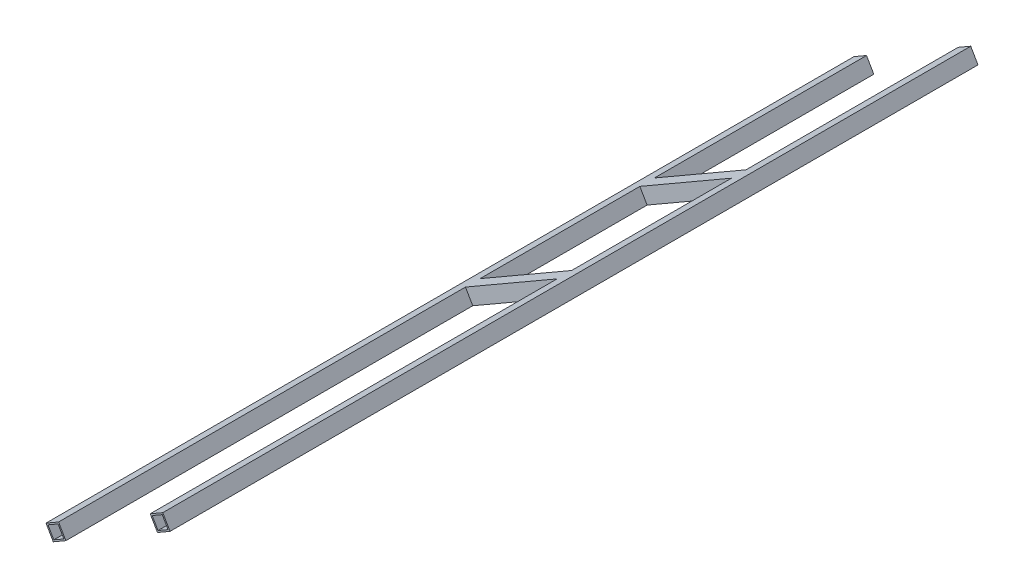
ISO-10303-21;
HEADER;
FILE_DESCRIPTION(('STEP AP214'),'2;1');
FILE_NAME('part.step','',(''),(''),'','','');
FILE_SCHEMA(('AUTOMOTIVE_DESIGN { 1 0 10303 214 1 1 1 1 }'));
ENDSEC;
DATA;
#1=APPLICATION_CONTEXT('core data for automotive mechanical design processes');
#2=APPLICATION_PROTOCOL_DEFINITION('international standard','automotive_design',2000,#1);
#3=PRODUCT_CONTEXT('',#1,'mechanical');
#4=PRODUCT('Part','Part','',(#3));
#5=PRODUCT_RELATED_PRODUCT_CATEGORY('part','',(#4));
#6=PRODUCT_DEFINITION_FORMATION('','',#4);
#7=PRODUCT_DEFINITION_CONTEXT('part definition',#1,'design');
#8=PRODUCT_DEFINITION('design','',#6,#7);
#9=PRODUCT_DEFINITION_SHAPE('','',#8);
#10=(LENGTH_UNIT() NAMED_UNIT(*) SI_UNIT(.MILLI.,.METRE.));
#11=(NAMED_UNIT(*) PLANE_ANGLE_UNIT() SI_UNIT($,.RADIAN.));
#12=(NAMED_UNIT(*) SI_UNIT($,.STERADIAN.) SOLID_ANGLE_UNIT());
#13=UNCERTAINTY_MEASURE_WITH_UNIT(LENGTH_MEASURE(1.E-05),#10,'distance_accuracy_value','');
#14=(GEOMETRIC_REPRESENTATION_CONTEXT(3) GLOBAL_UNCERTAINTY_ASSIGNED_CONTEXT((#13)) GLOBAL_UNIT_ASSIGNED_CONTEXT((#10,
#11,#12)) REPRESENTATION_CONTEXT('',''));
#15=CARTESIAN_POINT('',(0.,0.,0.));
#16=DIRECTION('',(0.,0.,1.));
#17=DIRECTION('',(1.,0.,0.));
#18=AXIS2_PLACEMENT_3D('',#15,#16,#17);
#19=CARTESIAN_POINT('',(230.918283708788,-157.653092530675,500000.000000032));
#20=DIRECTION('',(0.500000000000017,-0.866025403784429,0.));
#21=DIRECTION('',(0.866025403784429,0.500000000000017,0.));
#22=AXIS2_PLACEMENT_3D('',#19,#20,#21);
#23=PLANE('',#22);
#24=DIRECTION('',(0.,0.,1.));
#25=VECTOR('',#24,1.);
#26=CARTESIAN_POINT('',(250.828594313901,-146.157869343091,500000.000000032));
#27=LINE('',#26,#25);
#28=CARTESIAN_POINT('',(250.828594313956,-146.157869343075,1797.04999999997));
#29=VERTEX_POINT('',#28);
#30=CARTESIAN_POINT('',(250.828594313987,-146.157869343077,31.7499999998632));
#31=VERTEX_POINT('',#30);
#32=EDGE_CURVE('E475',#29,#31,#27,.F.);
#33=ORIENTED_EDGE('',*,*,#32,.T.);
#34=DIRECTION('',(-0.866025403784329,-0.50000000000019,0.));
#35=VECTOR('',#34,1.);
#36=CARTESIAN_POINT('',(250.828594313995,-146.157869343037,31.75));
#37=LINE('',#36,#35);
#38=CARTESIAN_POINT('',(228.831549057873,-158.857869343074,31.7499999999485));
#39=VERTEX_POINT('',#38);
#40=EDGE_CURVE('E428',#31,#39,#37,.T.);
#41=ORIENTED_EDGE('',*,*,#40,.T.);
#42=DIRECTION('',(0.,0.,1.));
#43=VECTOR('',#42,1.);
#44=CARTESIAN_POINT('',(228.831549057791,-158.857869343089,500000.000000032));
#45=LINE('',#44,#43);
#46=CARTESIAN_POINT('',(228.831549057873,-158.857869343071,1797.04999999992));
#47=VERTEX_POINT('',#46);
#48=EDGE_CURVE('E20',#39,#47,#45,.T.);
#49=ORIENTED_EDGE('',*,*,#48,.T.);
#50=DIRECTION('',(-0.866025403784409,-0.500000000000051,0.));
#51=VECTOR('',#50,1.);
#52=CARTESIAN_POINT('',(250.828594313995,-146.157869343028,1797.05));
#53=LINE('',#52,#51);
#54=EDGE_CURVE('E444',#29,#47,#53,.T.);
#55=ORIENTED_EDGE('',*,*,#54,.F.);
#56=EDGE_LOOP('',(#33,#41,#49,#55));
#57=FACE_BOUND('',#56,.T.);
#58=ADVANCED_FACE('F17',(#57),#23,.F.);
#59=CARTESIAN_POINT('',(217.920821551719,-139.959934955034,500000.000000032));
#60=DIRECTION('',(-0.866025403784429,-0.500000000000017,0.));
#61=DIRECTION('',(0.500000000000017,-0.866025403784429,0.));
#62=AXIS2_PLACEMENT_3D('',#59,#60,#61);
#63=PLANE('',#62);
#64=ORIENTED_EDGE('',*,*,#48,.F.);
#65=DIRECTION('',(-0.50000000000019,0.866025403784329,0.));
#66=VECTOR('',#65,1.);
#67=CARTESIAN_POINT('',(228.831549057881,-158.857869343037,31.75));
#68=LINE('',#67,#66);
#69=CARTESIAN_POINT('',(216.131549057838,-136.860824086947,31.7499999999485));
#70=VERTEX_POINT('',#69);
#71=EDGE_CURVE('E425',#39,#70,#68,.T.);
#72=ORIENTED_EDGE('',*,*,#71,.T.);
#73=DIRECTION('',(0.,0.,1.));
#74=VECTOR('',#73,1.);
#75=CARTESIAN_POINT('',(216.131549057902,-136.860824086958,500000.000000032));
#76=LINE('',#75,#74);
#77=CARTESIAN_POINT('',(216.131549057867,-136.860824086945,1797.04999999992));
#78=VERTEX_POINT('',#77);
#79=EDGE_CURVE('E477',#70,#78,#76,.T.);
#80=ORIENTED_EDGE('',*,*,#79,.T.);
#81=DIRECTION('',(-0.500000000000179,0.866025403784335,0.));
#82=VECTOR('',#81,1.);
#83=CARTESIAN_POINT('',(228.831549057881,-158.857869343024,1797.05));
#84=LINE('',#83,#82);
#85=EDGE_CURVE('E441',#47,#78,#84,.T.);
#86=ORIENTED_EDGE('',*,*,#85,.F.);
#87=EDGE_LOOP('',(#64,#72,#80,#86));
#88=FACE_BOUND('',#87,.T.);
#89=ADVANCED_FACE('F484',(#88),#63,.F.);
#90=CARTESIAN_POINT('',(220.47353476927,-134.353977467682,500000.000000032));
#91=DIRECTION('',(-0.500000000000017,0.866025403784429,0.));
#92=DIRECTION('',(-0.866025403784429,-0.500000000000017,0.));
#93=AXIS2_PLACEMENT_3D('',#90,#91,#92);
#94=PLANE('',#93);
#95=ORIENTED_EDGE('',*,*,#79,.F.);
#96=DIRECTION('',(0.866025403784328,0.500000000000191,0.));
#97=VECTOR('',#96,1.);
#98=CARTESIAN_POINT('',(216.131549057881,-136.860824086923,31.75));
#99=LINE('',#98,#97);
#100=CARTESIAN_POINT('',(238.128594313989,-124.160824086953,31.7499999999485));
#101=VERTEX_POINT('',#100);
#102=EDGE_CURVE('E422',#70,#101,#99,.T.);
#103=ORIENTED_EDGE('',*,*,#102,.T.);
#104=DIRECTION('',(0.,0.,1.));
#105=VECTOR('',#104,1.);
#106=CARTESIAN_POINT('',(238.128594313905,-124.160824086975,500000.000000032));
#107=LINE('',#106,#105);
#108=CARTESIAN_POINT('',(238.128594313989,-124.16082408695,1797.04999999992));
#109=VERTEX_POINT('',#108);
#110=EDGE_CURVE('E472',#101,#109,#107,.T.);
#111=ORIENTED_EDGE('',*,*,#110,.T.);
#112=DIRECTION('',(0.866025403784409,0.500000000000051,0.));
#113=VECTOR('',#112,1.);
#114=CARTESIAN_POINT('',(216.131549057881,-136.860824086909,1797.05));
#115=LINE('',#114,#113);
#116=EDGE_CURVE('E449',#78,#109,#115,.T.);
#117=ORIENTED_EDGE('',*,*,#116,.F.);
#118=EDGE_LOOP('',(#95,#103,#111,#117));
#119=FACE_BOUND('',#118,.T.);
#120=ADVANCED_FACE('F490',(#119),#94,.F.);
#121=CARTESIAN_POINT('',(239.986804896093,-127.379339226486,500000.000000032));
#122=DIRECTION('',(0.866025403784429,0.500000000000017,0.));
#123=DIRECTION('',(-0.500000000000017,0.866025403784429,0.));
#124=AXIS2_PLACEMENT_3D('',#121,#122,#123);
#125=PLANE('',#124);
#126=ORIENTED_EDGE('',*,*,#110,.F.);
#127=DIRECTION('',(0.50000000000019,-0.866025403784329,0.));
#128=VECTOR('',#127,1.);
#129=CARTESIAN_POINT('',(238.128594313995,-124.160824086923,31.75));
#130=LINE('',#129,#128);
#131=EDGE_CURVE('E419',#101,#31,#130,.T.);
#132=ORIENTED_EDGE('',*,*,#131,.T.);
#133=ORIENTED_EDGE('',*,*,#32,.F.);
#134=DIRECTION('',(0.500000000000179,-0.866025403784335,0.));
#135=VECTOR('',#134,1.);
#136=CARTESIAN_POINT('',(238.128594313995,-124.160824086914,1797.05));
#137=LINE('',#136,#135);
#138=EDGE_CURVE('E446',#109,#29,#137,.T.);
#139=ORIENTED_EDGE('',*,*,#138,.F.);
#140=EDGE_LOOP('',(#126,#132,#133,#139));
#141=FACE_BOUND('',#140,.T.);
#142=ADVANCED_FACE('F495',(#141),#125,.F.);
#143=CARTESIAN_POINT('',(12.2484484069404,-258.70493495511,500000.000000032));
#144=DIRECTION('',(-0.866025403784429,-0.500000000000017,0.));
#145=DIRECTION('',(0.500000000000017,-0.866025403784429,0.));
#146=AXIS2_PLACEMENT_3D('',#143,#144,#145);
#147=PLANE('',#146);
#148=DIRECTION('',(0.,0.,1.));
#149=VECTOR('',#148,1.);
#150=CARTESIAN_POINT('',(10.4591759131484,-255.605824086928,500000.000000032));
#151=LINE('',#150,#149);
#152=CARTESIAN_POINT('',(10.4591759130737,-255.605824086886,31.7499999999485));
#153=VERTEX_POINT('',#152);
#154=CARTESIAN_POINT('',(10.4591759130232,-255.605824086874,1797.04999999984));
#155=VERTEX_POINT('',#154);
#156=EDGE_CURVE('E466',#153,#155,#151,.T.);
#157=ORIENTED_EDGE('',*,*,#156,.F.);
#158=DIRECTION('',(0.499999999997892,-0.866025403785656,0.));
#159=VECTOR('',#158,1.);
#160=CARTESIAN_POINT('',(10.4591759130719,-255.605824086796,31.75));
#161=LINE('',#160,#159);
#162=CARTESIAN_POINT('',(23.1591759130508,-277.602869343055,31.7499999999485));
#163=VERTEX_POINT('',#162);
#164=EDGE_CURVE('E387',#153,#163,#161,.T.);
#165=ORIENTED_EDGE('',*,*,#164,.T.);
#166=DIRECTION('',(0.,0.,1.));
#167=VECTOR('',#166,1.);
#168=CARTESIAN_POINT('',(23.1591759130679,-277.60286934302,500000.000000032));
#169=LINE('',#168,#167);
#170=CARTESIAN_POINT('',(23.1591759130326,-277.602869343082,1797.04999999992));
#171=VERTEX_POINT('',#170);
#172=EDGE_CURVE('E470',#171,#163,#169,.F.);
#173=ORIENTED_EDGE('',*,*,#172,.F.);
#174=DIRECTION('',(0.499999999997272,-0.866025403786013,0.));
#175=VECTOR('',#174,1.);
#176=CARTESIAN_POINT('',(10.4591759130922,-255.605824086786,1797.05));
#177=LINE('',#176,#175);
#178=EDGE_CURVE('E372',#155,#171,#177,.T.);
#179=ORIENTED_EDGE('',*,*,#178,.F.);
#180=EDGE_LOOP('',(#157,#165,#173,#179));
#181=FACE_BOUND('',#180,.T.);
#182=ADVANCED_FACE('F605',(#181),#147,.T.);
#183=CARTESIAN_POINT('',(21.0724412620715,-278.8076461555,500000.000000032));
#184=DIRECTION('',(-0.500000000000017,0.866025403784429,0.));
#185=DIRECTION('',(-0.866025403784429,-0.500000000000017,0.));
#186=AXIS2_PLACEMENT_3D('',#183,#184,#185);
#187=PLANE('',#186);
#188=ORIENTED_EDGE('',*,*,#172,.T.);
#189=DIRECTION('',(-0.866025403784279,-0.500000000000276,0.));
#190=VECTOR('',#189,1.);
#191=CARTESIAN_POINT('',(23.1591759130821,-277.602869343062,31.75));
#192=LINE('',#191,#190);
#193=CARTESIAN_POINT('',(1.1621306569291,-290.302869343055,31.7499999999485));
#194=VERTEX_POINT('',#193);
#195=EDGE_CURVE('E396',#163,#194,#192,.T.);
#196=ORIENTED_EDGE('',*,*,#195,.T.);
#197=DIRECTION('',(0.,0.,1.));
#198=VECTOR('',#197,1.);
#199=CARTESIAN_POINT('',(1.16213065684692,-290.302869343123,500000.000000032));
#200=LINE('',#199,#198);
#201=CARTESIAN_POINT('',(1.16213065692389,-290.302869343056,1797.04999999992));
#202=VERTEX_POINT('',#201);
#203=EDGE_CURVE('E468',#202,#194,#200,.F.);
#204=ORIENTED_EDGE('',*,*,#203,.F.);
#205=DIRECTION('',(-0.866025403784665,-0.499999999999608,0.));
#206=VECTOR('',#205,1.);
#207=CARTESIAN_POINT('',(23.1591759130922,-277.60286934307,1797.05));
#208=LINE('',#207,#206);
#209=EDGE_CURVE('E370',#171,#202,#208,.T.);
#210=ORIENTED_EDGE('',*,*,#209,.F.);
#211=EDGE_LOOP('',(#188,#196,#204,#210));
#212=FACE_BOUND('',#211,.T.);
#213=ADVANCED_FACE('F601',(#212),#187,.T.);
#214=CARTESIAN_POINT('',(-9.67965876092062,-271.524339226588,500000.000000032));
#215=DIRECTION('',(0.866025403784429,0.500000000000017,0.));
#216=DIRECTION('',(-0.500000000000017,0.866025403784429,0.));
#217=AXIS2_PLACEMENT_3D('',#214,#215,#216);
#218=PLANE('',#217);
#219=ORIENTED_EDGE('',*,*,#203,.T.);
#220=DIRECTION('',(-0.499999999997817,0.866025403785699,0.));
#221=VECTOR('',#220,1.);
#222=CARTESIAN_POINT('',(1.16213065697356,-290.302869343062,31.75));
#223=LINE('',#222,#221);
#224=CARTESIAN_POINT('',(-11.53786934311,-268.305824086881,31.7499999999059));
#225=VERTEX_POINT('',#224);
#226=EDGE_CURVE('E393',#194,#225,#223,.T.);
#227=ORIENTED_EDGE('',*,*,#226,.T.);
#228=DIRECTION('',(0.,0.,1.));
#229=VECTOR('',#228,1.);
#230=CARTESIAN_POINT('',(-11.537869342983,-268.305824086933,500000.000000032));
#231=LINE('',#230,#229);
#232=CARTESIAN_POINT('',(-11.5378693431169,-268.305824086878,1797.04999999992));
#233=VERTEX_POINT('',#232);
#234=EDGE_CURVE('E464',#233,#225,#231,.F.);
#235=ORIENTED_EDGE('',*,*,#234,.F.);
#236=DIRECTION('',(-0.499999999997706,0.866025403785763,0.));
#237=VECTOR('',#236,1.);
#238=CARTESIAN_POINT('',(1.16213065695273,-290.302869343066,1797.05));
#239=LINE('',#238,#237);
#240=EDGE_CURVE('E368',#202,#233,#239,.T.);
#241=ORIENTED_EDGE('',*,*,#240,.F.);
#242=EDGE_LOOP('',(#219,#227,#235,#241));
#243=FACE_BOUND('',#242,.T.);
#244=ADVANCED_FACE('F594',(#243),#218,.T.);
#245=CARTESIAN_POINT('',(6.117190201587,-258.112670706316,500000.000000032));
#246=DIRECTION('',(0.500000000000017,-0.866025403784429,0.));
#247=DIRECTION('',(0.866025403784429,0.500000000000017,0.));
#248=AXIS2_PLACEMENT_3D('',#245,#246,#247);
#249=PLANE('',#248);
#250=ORIENTED_EDGE('',*,*,#234,.T.);
#251=DIRECTION('',(0.866025403784254,0.50000000000032,0.));
#252=VECTOR('',#251,1.);
#253=CARTESIAN_POINT('',(-11.5378693430341,-268.305824086796,31.75));
#254=LINE('',#253,#252);
#255=EDGE_CURVE('E390',#225,#153,#254,.T.);
#256=ORIENTED_EDGE('',*,*,#255,.T.);
#257=ORIENTED_EDGE('',*,*,#156,.T.);
#258=DIRECTION('',(0.866025403784809,0.499999999999358,0.));
#259=VECTOR('',#258,1.);
#260=CARTESIAN_POINT('',(-11.537869343062,-268.305824086781,1797.05));
#261=LINE('',#260,#259);
#262=EDGE_CURVE('E365',#233,#155,#261,.T.);
#263=ORIENTED_EDGE('',*,*,#262,.F.);
#264=EDGE_LOOP('',(#250,#256,#257,#263));
#265=FACE_BOUND('',#264,.T.);
#266=ADVANCED_FACE('F587',(#265),#249,.T.);
#267=CARTESIAN_POINT('',(4.529690201587,-255.363040049378,500000.000000032));
#268=DIRECTION('',(0.500000000000017,-0.866025403784429,0.));
#269=DIRECTION('',(0.866025403784429,0.500000000000017,0.));
#270=AXIS2_PLACEMENT_3D('',#267,#268,#269);
#271=PLANE('',#270);
#272=DIRECTION('',(0.,0.,1.));
#273=VECTOR('',#272,1.);
#274=CARTESIAN_POINT('',(11.6213065704109,-251.268693430687,500000.000000032));
#275=LINE('',#274,#273);
#276=CARTESIAN_POINT('',(11.6213065702935,-251.268693430331,876.299999999968));
#277=VERTEX_POINT('',#276);
#278=CARTESIAN_POINT('',(11.6213065702935,-251.268693430331,527.049999999938));
#279=VERTEX_POINT('',#278);
#280=EDGE_CURVE('E350',#277,#279,#275,.F.);
#281=ORIENTED_EDGE('',*,*,#280,.T.);
#282=DIRECTION('',(-0.866025403784456,-0.499999999999969,0.));
#283=VECTOR('',#282,1.);
#284=CARTESIAN_POINT('',(211.794418401212,-135.698693430641,527.05));
#285=LINE('',#284,#283);
#286=CARTESIAN_POINT('',(211.794418401027,-135.698693430338,527.049999999981));
#287=VERTEX_POINT('',#286);
#288=EDGE_CURVE('E363',#287,#279,#285,.T.);
#289=ORIENTED_EDGE('',*,*,#288,.F.);
#290=DIRECTION('',(0.,0.,1.));
#291=VECTOR('',#290,1.);
#292=CARTESIAN_POINT('',(211.794418401182,-135.698693430695,500000.000000032));
#293=LINE('',#292,#291);
#294=CARTESIAN_POINT('',(211.794418401108,-135.69869343051,876.300000000011));
#295=VERTEX_POINT('',#294);
#296=EDGE_CURVE('E361',#295,#287,#293,.F.);
#297=ORIENTED_EDGE('',*,*,#296,.F.);
#298=DIRECTION('',(-0.866025403784456,-0.499999999999969,0.));
#299=VECTOR('',#298,1.);
#300=CARTESIAN_POINT('',(211.794418401212,-135.698693430641,876.3));
#301=LINE('',#300,#299);
#302=EDGE_CURVE('E353',#295,#277,#301,.T.);
#303=ORIENTED_EDGE('',*,*,#302,.T.);
#304=EDGE_LOOP('',(#281,#289,#297,#303));
#305=FACE_BOUND('',#304,.T.);
#306=DIRECTION('',(0.,0.,1.));
#307=VECTOR('',#306,1.);
#308=CARTESIAN_POINT('',(11.6213065701606,-251.268693430254,500000.000000032));
#309=LINE('',#308,#307);
#310=CARTESIAN_POINT('',(11.6213065701899,-251.268693430169,1797.04999999984));
#311=VERTEX_POINT('',#310);
#312=CARTESIAN_POINT('',(11.6213065702696,-251.268693430245,908.049999999959));
#313=VERTEX_POINT('',#312);
#314=EDGE_CURVE('E462',#311,#313,#309,.F.);
#315=ORIENTED_EDGE('',*,*,#314,.T.);
#316=DIRECTION('',(-0.86602540378435,-0.500000000000154,0.));
#317=VECTOR('',#316,1.);
#318=CARTESIAN_POINT('',(211.794418401325,-135.698693430697,908.05));
#319=LINE('',#318,#317);
#320=CARTESIAN_POINT('',(211.794418401015,-135.698693430219,908.050000000002));
#321=VERTEX_POINT('',#320);
#322=EDGE_CURVE('E182',#321,#313,#319,.T.);
#323=ORIENTED_EDGE('',*,*,#322,.F.);
#324=DIRECTION('',(0.,0.,1.));
#325=VECTOR('',#324,1.);
#326=CARTESIAN_POINT('',(211.794418400911,-135.698693430225,500000.000000032));
#327=LINE('',#326,#325);
#328=CARTESIAN_POINT('',(211.794418400939,-135.698693430154,1797.05000000001));
#329=VERTEX_POINT('',#328);
#330=EDGE_CURVE('E176',#329,#321,#327,.F.);
#331=ORIENTED_EDGE('',*,*,#330,.F.);
#332=DIRECTION('',(-0.866025403779533,-0.500000000008496,0.));
#333=VECTOR('',#332,1.);
#334=CARTESIAN_POINT('',(239.290724971035,-119.823693429908,1797.05));
#335=LINE('',#334,#333);
#336=CARTESIAN_POINT('',(239.290724971026,-119.823693429957,1797.05000000001));
#337=VERTEX_POINT('',#336);
#338=EDGE_CURVE('E451',#337,#329,#335,.T.);
#339=ORIENTED_EDGE('',*,*,#338,.F.);
#340=DIRECTION('',(0.,0.,1.));
#341=VECTOR('',#340,1.);
#342=CARTESIAN_POINT('',(239.290724970926,-119.823693429971,500000.000000032));
#343=LINE('',#342,#341);
#344=CARTESIAN_POINT('',(239.29072497099,-119.823693429956,31.7500000000196));
#345=VERTEX_POINT('',#344);
#346=EDGE_CURVE('E439',#345,#337,#343,.T.);
#347=ORIENTED_EDGE('',*,*,#346,.F.);
#348=DIRECTION('',(-0.866025403779865,-0.500000000007922,0.));
#349=VECTOR('',#348,1.);
#350=CARTESIAN_POINT('',(239.290724971035,-119.823693429909,31.75));
#351=LINE('',#350,#349);
#352=CARTESIAN_POINT('',(211.794418401009,-135.698693430206,31.7499999999911));
#353=VERTEX_POINT('',#352);
#354=EDGE_CURVE('E431',#345,#353,#351,.T.);
#355=ORIENTED_EDGE('',*,*,#354,.T.);
#356=DIRECTION('',(0.,0.,1.));
#357=VECTOR('',#356,1.);
#358=CARTESIAN_POINT('',(211.79441840119,-135.698693430708,500000.000000032));
#359=LINE('',#358,#357);
#360=CARTESIAN_POINT('',(211.794418401155,-135.698693430509,495.29999999999));
#361=VERTEX_POINT('',#360);
#362=EDGE_CURVE('E417',#361,#353,#359,.F.);
#363=ORIENTED_EDGE('',*,*,#362,.F.);
#364=DIRECTION('',(-0.866025403784412,-0.500000000000047,0.));
#365=VECTOR('',#364,1.);
#366=CARTESIAN_POINT('',(211.794418401325,-135.698693430641,495.3));
#367=LINE('',#366,#365);
#368=CARTESIAN_POINT('',(11.6213065703216,-251.268693430348,495.299999999947));
#369=VERTEX_POINT('',#368);
#370=EDGE_CURVE('E409',#361,#369,#367,.T.);
#371=ORIENTED_EDGE('',*,*,#370,.T.);
#372=DIRECTION('',(0.,0.,1.));
#373=VECTOR('',#372,1.);
#374=CARTESIAN_POINT('',(11.6213065704293,-251.268693430719,500000.000000032));
#375=LINE('',#374,#373);
#376=CARTESIAN_POINT('',(11.6213065703206,-251.268693430398,31.7499999999059));
#377=VERTEX_POINT('',#376);
#378=EDGE_CURVE('E407',#369,#377,#375,.F.);
#379=ORIENTED_EDGE('',*,*,#378,.T.);
#380=DIRECTION('',(-0.866025403789726,-0.499999999990843,0.));
#381=VECTOR('',#380,1.);
#382=CARTESIAN_POINT('',(11.6213065702614,-251.268693430163,31.75));
#383=LINE('',#382,#381);
#384=CARTESIAN_POINT('',(-15.8750000000591,-267.14369342991,31.7499999999088));
#385=VERTEX_POINT('',#384);
#386=EDGE_CURVE('E399',#377,#385,#383,.T.);
#387=ORIENTED_EDGE('',*,*,#386,.T.);
#388=DIRECTION('',(0.,0.,1.));
#389=VECTOR('',#388,1.);
#390=CARTESIAN_POINT('',(-15.8750000001895,-267.143693429945,500000.000000032));
#391=LINE('',#390,#389);
#392=CARTESIAN_POINT('',(-15.875000000043,-267.143693429933,1797.04999999997));
#393=VERTEX_POINT('',#392);
#394=EDGE_CURVE('E381',#385,#393,#391,.T.);
#395=ORIENTED_EDGE('',*,*,#394,.T.);
#396=DIRECTION('',(-0.866025403790421,-0.499999999989638,0.));
#397=VECTOR('',#396,1.);
#398=CARTESIAN_POINT('',(11.6213065702741,-251.268693430177,1797.05));
#399=LINE('',#398,#397);
#400=EDGE_CURVE('E376',#311,#393,#399,.T.);
#401=ORIENTED_EDGE('',*,*,#400,.F.);
#402=EDGE_LOOP('',(#315,#323,#331,#339,#347,#355,#363,#371,#379,#387,#395,#401));
#403=FACE_BOUND('',#402,.T.);
#404=ADVANCED_FACE('F542',(#305,#403),#271,.F.);
#405=CARTESIAN_POINT('',(14.9980790639571,-257.11743495511,500000.000000032));
#406=DIRECTION('',(-0.866025403784429,-0.500000000000017,0.));
#407=DIRECTION('',(0.500000000000017,-0.866025403784429,0.));
#408=AXIS2_PLACEMENT_3D('',#405,#406,#407);
#409=PLANE('',#408);
#410=DIRECTION('',(0.500000000000441,-0.866025403784184,0.));
#411=VECTOR('',#410,1.);
#412=CARTESIAN_POINT('',(11.6213065705892,-251.268693430745,908.05));
#413=LINE('',#412,#411);
#414=CARTESIAN_POINT('',(27.4963065703849,-278.765000000641,908.049999999832));
#415=VERTEX_POINT('',#414);
#416=EDGE_CURVE('E459',#313,#415,#413,.T.);
#417=ORIENTED_EDGE('',*,*,#416,.F.);
#418=ORIENTED_EDGE('',*,*,#314,.F.);
#419=DIRECTION('',(-0.500000000001028,0.866025403783845,0.));
#420=VECTOR('',#419,1.);
#421=CARTESIAN_POINT('',(27.496306570269,-278.765000000249,1797.05));
#422=LINE('',#421,#420);
#423=CARTESIAN_POINT('',(27.4963065703205,-278.765000000513,1797.04999999984));
#424=VERTEX_POINT('',#423);
#425=EDGE_CURVE('E378',#424,#311,#422,.T.);
#426=ORIENTED_EDGE('',*,*,#425,.F.);
#427=DIRECTION('',(0.,0.,1.));
#428=VECTOR('',#427,1.);
#429=CARTESIAN_POINT('',(27.4963065702043,-278.765000000142,500000.000000032));
#430=LINE('',#429,#428);
#431=EDGE_CURVE('E343',#424,#415,#430,.F.);
#432=ORIENTED_EDGE('',*,*,#431,.T.);
#433=EDGE_LOOP('',(#417,#418,#426,#432));
#434=FACE_BOUND('',#433,.T.);
#435=ADVANCED_FACE('F522',(#434),#409,.F.);
#436=CARTESIAN_POINT('',(499924.488723142,288355.407273458,908.05));
#437=DIRECTION('',(0.,0.,1.));
#438=DIRECTION('',(1.,0.,0.));
#439=AXIS2_PLACEMENT_3D('',#436,#437,#438);
#440=PLANE('',#439);
#441=ORIENTED_EDGE('',*,*,#416,.T.);
#442=DIRECTION('',(-0.866025403784429,-0.500000000000017,0.));
#443=VECTOR('',#442,1.);
#444=CARTESIAN_POINT('',(22.6599412620715,-281.557276812692,908.050000000003));
#445=LINE('',#444,#443);
#446=CARTESIAN_POINT('',(227.669418401188,-163.195000000669,908.050000000001));
#447=VERTEX_POINT('',#446);
#448=EDGE_CURVE('E340',#415,#447,#445,.F.);
#449=ORIENTED_EDGE('',*,*,#448,.T.);
#450=DIRECTION('',(0.500000000000017,-0.866025403784429,0.));
#451=VECTOR('',#450,1.);
#452=CARTESIAN_POINT('',(215.17119089468,-141.547434955034,908.050000000003));
#453=LINE('',#452,#451);
#454=EDGE_CURVE('E456',#321,#447,#453,.T.);
#455=ORIENTED_EDGE('',*,*,#454,.F.);
#456=ORIENTED_EDGE('',*,*,#322,.T.);
#457=EDGE_LOOP('',(#441,#449,#455,#456));
#458=FACE_BOUND('',#457,.T.);
#459=ADVANCED_FACE('F519',(#458),#440,.T.);
#460=CARTESIAN_POINT('',(215.17119089468,-141.547434955034,500000.000000032));
#461=DIRECTION('',(-0.866025403784429,-0.500000000000017,0.));
#462=DIRECTION('',(0.500000000000017,-0.866025403784429,0.));
#463=AXIS2_PLACEMENT_3D('',#460,#461,#462);
#464=PLANE('',#463);
#465=DIRECTION('',(0.,0.,1.));
#466=VECTOR('',#465,1.);
#467=CARTESIAN_POINT('',(227.669418400916,-163.19500000015,500000.000000032));
#468=LINE('',#467,#466);
#469=CARTESIAN_POINT('',(227.669418401082,-163.195000000552,1797.05000000001));
#470=VERTEX_POINT('',#469);
#471=EDGE_CURVE('E337',#447,#470,#468,.T.);
#472=ORIENTED_EDGE('',*,*,#471,.T.);
#473=DIRECTION('',(0.500000000000373,-0.866025403784223,0.));
#474=VECTOR('',#473,1.);
#475=CARTESIAN_POINT('',(211.79441840102,-135.698693430186,1797.05));
#476=LINE('',#475,#474);
#477=EDGE_CURVE('E454',#329,#470,#476,.T.);
#478=ORIENTED_EDGE('',*,*,#477,.F.);
#479=ORIENTED_EDGE('',*,*,#330,.T.);
#480=ORIENTED_EDGE('',*,*,#454,.T.);
#481=EDGE_LOOP('',(#472,#478,#479,#480));
#482=FACE_BOUND('',#481,.T.);
#483=ADVANCED_FACE('F517',(#482),#464,.T.);
#484=CARTESIAN_POINT('',(241.414785423032,-500000.000000032,1797.05));
#485=DIRECTION('',(0.,0.,1.));
#486=DIRECTION('',(1.,0.,0.));
#487=AXIS2_PLACEMENT_3D('',#484,#485,#486);
#488=PLANE('',#487);
#489=ORIENTED_EDGE('',*,*,#54,.T.);
#490=ORIENTED_EDGE('',*,*,#85,.T.);
#491=ORIENTED_EDGE('',*,*,#116,.T.);
#492=ORIENTED_EDGE('',*,*,#138,.T.);
#493=EDGE_LOOP('',(#489,#490,#491,#492));
#494=FACE_BOUND('',#493,.T.);
#495=DIRECTION('',(-0.500000000000017,0.866025403784429,0.));
#496=VECTOR('',#495,1.);
#497=CARTESIAN_POINT('',(242.736435553107,-125.791839226486,1797.05000000001));
#498=LINE('',#497,#496);
#499=CARTESIAN_POINT('',(255.165724971038,-147.320000000082,1797.05000000001));
#500=VERTEX_POINT('',#499);
#501=EDGE_CURVE('E437',#337,#500,#498,.F.);
#502=ORIENTED_EDGE('',*,*,#501,.F.);
#503=ORIENTED_EDGE('',*,*,#338,.T.);
#504=ORIENTED_EDGE('',*,*,#477,.T.);
#505=DIRECTION('',(-0.866025403784429,-0.500000000000017,0.));
#506=VECTOR('',#505,1.);
#507=CARTESIAN_POINT('',(22.6599412620715,-281.557276812692,1797.05000000001));
#508=LINE('',#507,#506);
#509=EDGE_CURVE('E334',#470,#500,#508,.F.);
#510=ORIENTED_EDGE('',*,*,#509,.T.);
#511=EDGE_LOOP('',(#502,#503,#504,#510));
#512=FACE_BOUND('',#511,.T.);
#513=ADVANCED_FACE('F487',(#494,#512),#488,.T.);
#514=CARTESIAN_POINT('',(242.736435553107,-125.791839226486,500000.000000032));
#515=DIRECTION('',(0.866025403784429,0.500000000000017,0.));
#516=DIRECTION('',(-0.500000000000017,0.866025403784429,0.));
#517=AXIS2_PLACEMENT_3D('',#514,#515,#516);
#518=PLANE('',#517);
#519=DIRECTION('',(0.,0.,1.));
#520=VECTOR('',#519,1.);
#521=CARTESIAN_POINT('',(255.165724971106,-147.32000000013,500000.000000032));
#522=LINE('',#521,#520);
#523=CARTESIAN_POINT('',(255.165724971005,-147.320000000115,31.7500000000338));
#524=VERTEX_POINT('',#523);
#525=EDGE_CURVE('E331',#500,#524,#522,.F.);
#526=ORIENTED_EDGE('',*,*,#525,.T.);
#527=DIRECTION('',(-0.500000000000444,0.866025403784183,0.));
#528=VECTOR('',#527,1.);
#529=CARTESIAN_POINT('',(255.16572497106,-147.320000000076,31.75));
#530=LINE('',#529,#528);
#531=EDGE_CURVE('E434',#524,#345,#530,.T.);
#532=ORIENTED_EDGE('',*,*,#531,.T.);
#533=ORIENTED_EDGE('',*,*,#346,.T.);
#534=ORIENTED_EDGE('',*,*,#501,.T.);
#535=EDGE_LOOP('',(#526,#532,#533,#534));
#536=FACE_BOUND('',#535,.T.);
#537=ADVANCED_FACE('F501',(#536),#518,.T.);
#538=CARTESIAN_POINT('',(8.96446768580906E-11,0.,31.75));
#539=DIRECTION('',(0.,0.,1.));
#540=DIRECTION('',(1.,0.,0.));
#541=AXIS2_PLACEMENT_3D('',#538,#539,#540);
#542=PLANE('',#541);
#543=ORIENTED_EDGE('',*,*,#102,.F.);
#544=ORIENTED_EDGE('',*,*,#71,.F.);
#545=ORIENTED_EDGE('',*,*,#40,.F.);
#546=ORIENTED_EDGE('',*,*,#131,.F.);
#547=EDGE_LOOP('',(#543,#544,#545,#546));
#548=FACE_BOUND('',#547,.T.);
#549=ORIENTED_EDGE('',*,*,#354,.F.);
#550=ORIENTED_EDGE('',*,*,#531,.F.);
#551=DIRECTION('',(-0.866025403784429,-0.500000000000017,0.));
#552=VECTOR('',#551,1.);
#553=CARTESIAN_POINT('',(22.6599412620715,-281.557276812692,31.750000000045));
#554=LINE('',#553,#552);
#555=CARTESIAN_POINT('',(227.669418400968,-163.195000000281,31.7500000000083));
#556=VERTEX_POINT('',#555);
#557=EDGE_CURVE('E328',#524,#556,#554,.T.);
#558=ORIENTED_EDGE('',*,*,#557,.T.);
#559=DIRECTION('',(0.500000000000017,-0.866025403784429,0.));
#560=VECTOR('',#559,1.);
#561=CARTESIAN_POINT('',(215.17119089468,-141.547434955034,31.7499999999882));
#562=LINE('',#561,#560);
#563=EDGE_CURVE('E415',#353,#556,#562,.T.);
#564=ORIENTED_EDGE('',*,*,#563,.F.);
#565=EDGE_LOOP('',(#549,#550,#558,#564));
#566=FACE_BOUND('',#565,.T.);
#567=ADVANCED_FACE('F497',(#548,#566),#542,.F.);
#568=CARTESIAN_POINT('',(215.17119089468,-141.547434955034,500000.000000032));
#569=DIRECTION('',(-0.866025403784429,-0.500000000000017,0.));
#570=DIRECTION('',(0.500000000000017,-0.866025403784429,0.));
#571=AXIS2_PLACEMENT_3D('',#568,#569,#570);
#572=PLANE('',#571);
#573=ORIENTED_EDGE('',*,*,#563,.T.);
#574=DIRECTION('',(0.,0.,1.));
#575=VECTOR('',#574,1.);
#576=CARTESIAN_POINT('',(227.669418400927,-163.195000000144,500000.000000032));
#577=LINE('',#576,#575);
#578=CARTESIAN_POINT('',(227.669418401014,-163.195000000399,495.29999999999));
#579=VERTEX_POINT('',#578);
#580=EDGE_CURVE('E325',#556,#579,#577,.T.);
#581=ORIENTED_EDGE('',*,*,#580,.T.);
#582=DIRECTION('',(-0.500000000001008,0.866025403783856,0.));
#583=VECTOR('',#582,1.);
#584=CARTESIAN_POINT('',(227.669418401319,-163.195000000712,495.3));
#585=LINE('',#584,#583);
#586=EDGE_CURVE('E412',#579,#361,#585,.T.);
#587=ORIENTED_EDGE('',*,*,#586,.T.);
#588=ORIENTED_EDGE('',*,*,#362,.T.);
#589=EDGE_LOOP('',(#573,#581,#587,#588));
#590=FACE_BOUND('',#589,.T.);
#591=ADVANCED_FACE('F500',(#590),#572,.T.);
#592=CARTESIAN_POINT('',(499908.623965057,288346.247751062,495.3));
#593=DIRECTION('',(0.,0.,1.));
#594=DIRECTION('',(1.,0.,0.));
#595=AXIS2_PLACEMENT_3D('',#592,#593,#594);
#596=PLANE('',#595);
#597=ORIENTED_EDGE('',*,*,#586,.F.);
#598=DIRECTION('',(-0.866025403784429,-0.500000000000017,0.));
#599=VECTOR('',#598,1.);
#600=CARTESIAN_POINT('',(22.6599412620715,-281.557276812692,495.299999999986));
#601=LINE('',#600,#599);
#602=CARTESIAN_POINT('',(27.4963065703419,-278.765000000502,495.29999999995));
#603=VERTEX_POINT('',#602);
#604=EDGE_CURVE('E322',#579,#603,#601,.T.);
#605=ORIENTED_EDGE('',*,*,#604,.T.);
#606=DIRECTION('',(0.500000000000017,-0.866025403784429,0.));
#607=VECTOR('',#606,1.);
#608=CARTESIAN_POINT('',(14.9980790639571,-257.11743495511,495.299999999759));
#609=LINE('',#608,#607);
#610=EDGE_CURVE('E404',#603,#369,#609,.F.);
#611=ORIENTED_EDGE('',*,*,#610,.T.);
#612=ORIENTED_EDGE('',*,*,#370,.F.);
#613=EDGE_LOOP('',(#597,#605,#611,#612));
#614=FACE_BOUND('',#613,.T.);
#615=ADVANCED_FACE('F540',(#614),#596,.F.);
#616=CARTESIAN_POINT('',(14.9980790639571,-257.11743495511,500000.000000032));
#617=DIRECTION('',(-0.866025403784429,-0.500000000000017,0.));
#618=DIRECTION('',(0.500000000000017,-0.866025403784429,0.));
#619=AXIS2_PLACEMENT_3D('',#616,#617,#618);
#620=PLANE('',#619);
#621=DIRECTION('',(0.,0.,1.));
#622=VECTOR('',#621,1.);
#623=CARTESIAN_POINT('',(27.4963065701939,-278.765000000148,500000.000000032));
#624=LINE('',#623,#622);
#625=CARTESIAN_POINT('',(27.4963065701762,-278.76500000027,31.7499999998206));
#626=VERTEX_POINT('',#625);
#627=EDGE_CURVE('E319',#603,#626,#624,.F.);
#628=ORIENTED_EDGE('',*,*,#627,.T.);
#629=DIRECTION('',(-0.500000000001062,0.866025403783825,0.));
#630=VECTOR('',#629,1.);
#631=CARTESIAN_POINT('',(27.496306570269,-278.765000000254,31.75));
#632=LINE('',#631,#630);
#633=EDGE_CURVE('E401',#626,#377,#632,.T.);
#634=ORIENTED_EDGE('',*,*,#633,.T.);
#635=ORIENTED_EDGE('',*,*,#378,.F.);
#636=ORIENTED_EDGE('',*,*,#610,.F.);
#637=EDGE_LOOP('',(#628,#634,#635,#636));
#638=FACE_BOUND('',#637,.T.);
#639=ADVANCED_FACE('F537',(#638),#620,.F.);
#640=CARTESIAN_POINT('',(8.96446768580906E-11,0.,31.75));
#641=DIRECTION('',(0.,0.,1.));
#642=DIRECTION('',(1.,0.,0.));
#643=AXIS2_PLACEMENT_3D('',#640,#641,#642);
#644=PLANE('',#643);
#645=ORIENTED_EDGE('',*,*,#255,.F.);
#646=ORIENTED_EDGE('',*,*,#226,.F.);
#647=ORIENTED_EDGE('',*,*,#195,.F.);
#648=ORIENTED_EDGE('',*,*,#164,.F.);
#649=EDGE_LOOP('',(#645,#646,#647,#648));
#650=FACE_BOUND('',#649,.T.);
#651=ORIENTED_EDGE('',*,*,#633,.F.);
#652=DIRECTION('',(-0.866025403784429,-0.500000000000017,0.));
#653=VECTOR('',#652,1.);
#654=CARTESIAN_POINT('',(22.6599412620715,-281.557276812692,31.7499999999882));
#655=LINE('',#654,#653);
#656=CARTESIAN_POINT('',(-5.58060952933773E-11,-294.640000000057,31.7499999999515));
#657=VERTEX_POINT('',#656);
#658=EDGE_CURVE('E316',#626,#657,#655,.T.);
#659=ORIENTED_EDGE('',*,*,#658,.T.);
#660=DIRECTION('',(-0.500000000000017,0.866025403784429,0.));
#661=VECTOR('',#660,1.);
#662=CARTESIAN_POINT('',(-12.4292894179348,-273.111839226588,31.7499999997608));
#663=LINE('',#662,#661);
#664=EDGE_CURVE('E384',#657,#385,#663,.T.);
#665=ORIENTED_EDGE('',*,*,#664,.T.);
#666=ORIENTED_EDGE('',*,*,#386,.F.);
#667=EDGE_LOOP('',(#651,#659,#665,#666));
#668=FACE_BOUND('',#667,.T.);
#669=ADVANCED_FACE('F533',(#650,#668),#644,.F.);
#670=CARTESIAN_POINT('',(-12.4292894179348,-273.111839226588,500000.000000032));
#671=DIRECTION('',(0.866025403784429,0.500000000000017,0.));
#672=DIRECTION('',(-0.500000000000017,0.866025403784429,0.));
#673=AXIS2_PLACEMENT_3D('',#670,#671,#672);
#674=PLANE('',#673);
#675=ORIENTED_EDGE('',*,*,#394,.F.);
#676=ORIENTED_EDGE('',*,*,#664,.F.);
#677=DIRECTION('',(0.,0.,1.));
#678=VECTOR('',#677,1.);
#679=CARTESIAN_POINT('',(4.69624339416441E-11,-294.640000000144,500000.000000032));
#680=LINE('',#679,#678);
#681=CARTESIAN_POINT('',(-1.00211397340011E-10,-294.640000000082,1797.04999999992));
#682=VERTEX_POINT('',#681);
#683=EDGE_CURVE('E313',#657,#682,#680,.T.);
#684=ORIENTED_EDGE('',*,*,#683,.T.);
#685=DIRECTION('',(0.499999999999347,-0.866025403784816,0.));
#686=VECTOR('',#685,1.);
#687=CARTESIAN_POINT('',(-15.8750000000406,-267.14369342983,1797.05));
#688=LINE('',#687,#686);
#689=EDGE_CURVE('E374',#393,#682,#688,.T.);
#690=ORIENTED_EDGE('',*,*,#689,.F.);
#691=EDGE_LOOP('',(#675,#676,#684,#690));
#692=FACE_BOUND('',#691,.T.);
#693=ADVANCED_FACE('F530',(#692),#674,.F.);
#694=CARTESIAN_POINT('',(241.414785423032,-500000.000000032,1797.05));
#695=DIRECTION('',(0.,0.,1.));
#696=DIRECTION('',(1.,0.,0.));
#697=AXIS2_PLACEMENT_3D('',#694,#695,#696);
#698=PLANE('',#697);
#699=ORIENTED_EDGE('',*,*,#240,.T.);
#700=ORIENTED_EDGE('',*,*,#262,.T.);
#701=ORIENTED_EDGE('',*,*,#178,.T.);
#702=ORIENTED_EDGE('',*,*,#209,.T.);
#703=EDGE_LOOP('',(#699,#700,#701,#702));
#704=FACE_BOUND('',#703,.T.);
#705=ORIENTED_EDGE('',*,*,#689,.T.);
#706=DIRECTION('',(-0.866025403784429,-0.500000000000017,0.));
#707=VECTOR('',#706,1.);
#708=CARTESIAN_POINT('',(22.6599412620715,-281.557276812692,1797.05000000001));
#709=LINE('',#708,#707);
#710=EDGE_CURVE('E310',#682,#424,#709,.F.);
#711=ORIENTED_EDGE('',*,*,#710,.T.);
#712=ORIENTED_EDGE('',*,*,#425,.T.);
#713=ORIENTED_EDGE('',*,*,#400,.T.);
#714=EDGE_LOOP('',(#705,#711,#712,#713));
#715=FACE_BOUND('',#714,.T.);
#716=ADVANCED_FACE('F544',(#704,#715),#698,.T.);
#717=CARTESIAN_POINT('',(499908.623965057,288346.247751062,527.05));
#718=DIRECTION('',(0.,0.,1.));
#719=DIRECTION('',(1.,0.,0.));
#720=AXIS2_PLACEMENT_3D('',#717,#718,#719);
#721=PLANE('',#720);
#722=DIRECTION('',(0.500000000000017,-0.866025403784429,0.));
#723=VECTOR('',#722,1.);
#724=CARTESIAN_POINT('',(14.9980790639571,-257.11743495511,527.049999999747));
#725=LINE('',#724,#723);
#726=CARTESIAN_POINT('',(27.4963065703998,-278.765000000627,527.049999999902));
#727=VERTEX_POINT('',#726);
#728=EDGE_CURVE('E347',#279,#727,#725,.T.);
#729=ORIENTED_EDGE('',*,*,#728,.T.);
#730=DIRECTION('',(-0.866025403784429,-0.500000000000017,0.));
#731=VECTOR('',#730,1.);
#732=CARTESIAN_POINT('',(22.6599412620715,-281.557276812692,527.049999999974));
#733=LINE('',#732,#731);
#734=CARTESIAN_POINT('',(227.669418401144,-163.195000000665,527.049999999987));
#735=VERTEX_POINT('',#734);
#736=EDGE_CURVE('E307',#727,#735,#733,.F.);
#737=ORIENTED_EDGE('',*,*,#736,.T.);
#738=DIRECTION('',(0.500000000000017,-0.866025403784429,0.));
#739=VECTOR('',#738,1.);
#740=CARTESIAN_POINT('',(215.17119089468,-141.547434955034,527.049999999974));
#741=LINE('',#740,#739);
#742=EDGE_CURVE('E359',#287,#735,#741,.T.);
#743=ORIENTED_EDGE('',*,*,#742,.F.);
#744=ORIENTED_EDGE('',*,*,#288,.T.);
#745=EDGE_LOOP('',(#729,#737,#743,#744));
#746=FACE_BOUND('',#745,.T.);
#747=ADVANCED_FACE('F546',(#746),#721,.T.);
#748=CARTESIAN_POINT('',(215.17119089468,-141.547434955034,500000.000000032));
#749=DIRECTION('',(-0.866025403784429,-0.500000000000017,0.));
#750=DIRECTION('',(0.500000000000017,-0.866025403784429,0.));
#751=AXIS2_PLACEMENT_3D('',#748,#749,#750);
#752=PLANE('',#751);
#753=DIRECTION('',(0.,0.,1.));
#754=VECTOR('',#753,1.);
#755=CARTESIAN_POINT('',(227.669418400877,-163.195000000173,500000.000000032));
#756=LINE('',#755,#754);
#757=CARTESIAN_POINT('',(227.669418401122,-163.195000000653,876.300000000011));
#758=VERTEX_POINT('',#757);
#759=EDGE_CURVE('E304',#735,#758,#756,.T.);
#760=ORIENTED_EDGE('',*,*,#759,.T.);
#761=DIRECTION('',(-0.500000000001576,0.866025403783529,0.));
#762=VECTOR('',#761,1.);
#763=CARTESIAN_POINT('',(227.669418401263,-163.195000000769,876.3));
#764=LINE('',#763,#762);
#765=EDGE_CURVE('E356',#758,#295,#764,.T.);
#766=ORIENTED_EDGE('',*,*,#765,.T.);
#767=ORIENTED_EDGE('',*,*,#296,.T.);
#768=ORIENTED_EDGE('',*,*,#742,.T.);
#769=EDGE_LOOP('',(#760,#766,#767,#768));
#770=FACE_BOUND('',#769,.T.);
#771=ADVANCED_FACE('F554',(#770),#752,.T.);
#772=CARTESIAN_POINT('',(499924.488723142,288355.407273458,876.3));
#773=DIRECTION('',(0.,0.,1.));
#774=DIRECTION('',(1.,0.,0.));
#775=AXIS2_PLACEMENT_3D('',#772,#773,#774);
#776=PLANE('',#775);
#777=ORIENTED_EDGE('',*,*,#765,.F.);
#778=DIRECTION('',(-0.866025403784429,-0.500000000000017,0.));
#779=VECTOR('',#778,1.);
#780=CARTESIAN_POINT('',(22.6599412620715,-281.557276812692,876.300000000015));
#781=LINE('',#780,#779);
#782=CARTESIAN_POINT('',(27.4963065703714,-278.765000000627,876.299999999965));
#783=VERTEX_POINT('',#782);
#784=EDGE_CURVE('E26',#758,#783,#781,.T.);
#785=ORIENTED_EDGE('',*,*,#784,.T.);
#786=DIRECTION('',(0.500000000000017,-0.866025403784429,0.));
#787=VECTOR('',#786,1.);
#788=CARTESIAN_POINT('',(14.9980790639571,-257.11743495511,876.299999999787));
#789=LINE('',#788,#787);
#790=EDGE_CURVE('E34',#783,#277,#789,.F.);
#791=ORIENTED_EDGE('',*,*,#790,.T.);
#792=ORIENTED_EDGE('',*,*,#302,.F.);
#793=EDGE_LOOP('',(#777,#785,#791,#792));
#794=FACE_BOUND('',#793,.T.);
#795=ADVANCED_FACE('F566',(#794),#776,.F.);
#796=CARTESIAN_POINT('',(14.9980790639571,-257.11743495511,500000.000000032));
#797=DIRECTION('',(-0.866025403784429,-0.500000000000017,0.));
#798=DIRECTION('',(0.500000000000017,-0.866025403784429,0.));
#799=AXIS2_PLACEMENT_3D('',#796,#797,#798);
#800=PLANE('',#799);
#801=DIRECTION('',(0.,0.,1.));
#802=VECTOR('',#801,1.);
#803=CARTESIAN_POINT('',(27.4963065701504,-278.765000000173,500000.000000032));
#804=LINE('',#803,#802);
#805=EDGE_CURVE('E11',#783,#727,#804,.F.);
#806=ORIENTED_EDGE('',*,*,#805,.T.);
#807=ORIENTED_EDGE('',*,*,#728,.F.);
#808=ORIENTED_EDGE('',*,*,#280,.F.);
#809=ORIENTED_EDGE('',*,*,#790,.F.);
#810=EDGE_LOOP('',(#806,#807,#808,#809));
#811=FACE_BOUND('',#810,.T.);
#812=ADVANCED_FACE('F559',(#811),#800,.F.);
#813=CARTESIAN_POINT('',(22.6599412620715,-281.557276812692,500000.000000032));
#814=DIRECTION('',(-0.500000000000017,0.866025403784429,0.));
#815=DIRECTION('',(-0.866025403784429,-0.500000000000017,0.));
#816=AXIS2_PLACEMENT_3D('',#813,#814,#815);
#817=PLANE('',#816);
#818=ORIENTED_EDGE('',*,*,#784,.F.);
#819=ORIENTED_EDGE('',*,*,#759,.F.);
#820=ORIENTED_EDGE('',*,*,#736,.F.);
#821=ORIENTED_EDGE('',*,*,#805,.F.);
#822=EDGE_LOOP('',(#818,#819,#820,#821));
#823=FACE_BOUND('',#822,.T.);
#824=ORIENTED_EDGE('',*,*,#683,.F.);
#825=ORIENTED_EDGE('',*,*,#658,.F.);
#826=ORIENTED_EDGE('',*,*,#627,.F.);
#827=ORIENTED_EDGE('',*,*,#604,.F.);
#828=ORIENTED_EDGE('',*,*,#580,.F.);
#829=ORIENTED_EDGE('',*,*,#557,.F.);
#830=ORIENTED_EDGE('',*,*,#525,.F.);
#831=ORIENTED_EDGE('',*,*,#509,.F.);
#832=ORIENTED_EDGE('',*,*,#471,.F.);
#833=ORIENTED_EDGE('',*,*,#448,.F.);
#834=ORIENTED_EDGE('',*,*,#431,.F.);
#835=ORIENTED_EDGE('',*,*,#710,.F.);
#836=EDGE_LOOP('',(#824,#825,#826,#827,#828,#829,#830,#831,#832,#833,#834,#835));
#837=FACE_BOUND('',#836,.T.);
#838=ADVANCED_FACE('F514',(#823,#837),#817,.F.);
#839=CLOSED_SHELL('',(#58,#89,#120,#142,#182,#213,#244,#266,#404,#435,#459,#483,#513,#537,#567,
#591,#615,#639,#669,#693,#716,#747,#771,#795,#812,#838));
#840=CARTESIAN_POINT('',(499915.051155459,288335.115530784,443.368889809952));
#841=DIRECTION('',(0.500000000000017,-0.866025403784429,0.));
#842=DIRECTION('',(0.866025403784429,0.500000000000017,0.));
#843=AXIS2_PLACEMENT_3D('',#840,#841,#842);
#844=PLANE('',#843);
#845=DIRECTION('',(0.,0.,1.));
#846=VECTOR('',#845,1.);
#847=CARTESIAN_POINT('',(226.081918399292,-160.445369340561,500000.000000032));
#848=LINE('',#847,#846);
#849=CARTESIAN_POINT('',(226.081918398487,-160.445369339064,498.474999999995));
#850=VERTEX_POINT('',#849);
#851=CARTESIAN_POINT('',(226.081918397637,-160.445369337597,523.874999999991));
#852=VERTEX_POINT('',#851);
#853=EDGE_CURVE('E299',#850,#852,#848,.T.);
#854=ORIENTED_EDGE('',*,*,#853,.F.);
#855=DIRECTION('',(0.866025403784518,0.499999999999863,0.));
#856=VECTOR('',#855,1.);
#857=CARTESIAN_POINT('',(25.9088065686228,-276.015369340485,498.475));
#858=LINE('',#857,#856);
#859=CARTESIAN_POINT('',(25.9088065677439,-276.015369339034,498.47499999991));
#860=VERTEX_POINT('',#859);
#861=EDGE_CURVE('E286',#860,#850,#858,.T.);
#862=ORIENTED_EDGE('',*,*,#861,.F.);
#863=DIRECTION('',(0.,0.,1.));
#864=VECTOR('',#863,1.);
#865=CARTESIAN_POINT('',(25.9088065685134,-276.01536934054,500000.000000032));
#866=LINE('',#865,#864);
#867=CARTESIAN_POINT('',(25.9088065669612,-276.015369337542,523.874999999949));
#868=VERTEX_POINT('',#867);
#869=EDGE_CURVE('E214',#860,#868,#866,.T.);
#870=ORIENTED_EDGE('',*,*,#869,.T.);
#871=DIRECTION('',(0.866025403784501,0.499999999999891,0.));
#872=VECTOR('',#871,1.);
#873=CARTESIAN_POINT('',(25.9088065686797,-276.015369340485,523.875));
#874=LINE('',#873,#872);
#875=EDGE_CURVE('E217',#868,#852,#874,.T.);
#876=ORIENTED_EDGE('',*,*,#875,.T.);
#877=EDGE_LOOP('',(#854,#862,#870,#876));
#878=FACE_BOUND('',#877,.T.);
#879=ADVANCED_FACE('F570',(#878),#844,.F.);
#880=CARTESIAN_POINT('',(215.17119089468,-141.547434955034,500000.000000032));
#881=DIRECTION('',(-0.866025403784429,-0.500000000000017,0.));
#882=DIRECTION('',(0.500000000000017,-0.866025403784429,0.));
#883=AXIS2_PLACEMENT_3D('',#880,#881,#882);
#884=PLANE('',#883);
#885=ORIENTED_EDGE('',*,*,#853,.T.);
#886=DIRECTION('',(-0.499999999997969,0.866025403785612,0.));
#887=VECTOR('',#886,1.);
#888=CARTESIAN_POINT('',(226.081918399359,-160.44536934055,523.875));
#889=LINE('',#888,#887);
#890=CARTESIAN_POINT('',(213.381918419813,-138.448324119889,523.874999999988));
#891=VERTEX_POINT('',#890);
#892=EDGE_CURVE('E296',#852,#891,#889,.T.);
#893=ORIENTED_EDGE('',*,*,#892,.T.);
#894=DIRECTION('',(0.,0.,1.));
#895=VECTOR('',#894,1.);
#896=CARTESIAN_POINT('',(213.381918437562,-138.448324150602,443.368889809952));
#897=LINE('',#896,#895);
#898=CARTESIAN_POINT('',(213.381918419813,-138.448324119874,498.474999999992));
#899=VERTEX_POINT('',#898);
#900=EDGE_CURVE('E283',#899,#891,#897,.T.);
#901=ORIENTED_EDGE('',*,*,#900,.F.);
#902=DIRECTION('',(-0.499999999999647,0.866025403784643,0.));
#903=VECTOR('',#902,1.);
#904=CARTESIAN_POINT('',(226.081918399416,-160.445369340493,498.475));
#905=LINE('',#904,#903);
#906=EDGE_CURVE('E290',#850,#899,#905,.T.);
#907=ORIENTED_EDGE('',*,*,#906,.F.);
#908=EDGE_LOOP('',(#885,#893,#901,#907));
#909=FACE_BOUND('',#908,.T.);
#910=ADVANCED_FACE('F788',(#909),#884,.T.);
#911=CARTESIAN_POINT('',(499908.623965057,288346.247751062,523.875));
#912=DIRECTION('',(0.,0.,1.));
#913=DIRECTION('',(1.,0.,0.));
#914=AXIS2_PLACEMENT_3D('',#911,#912,#913);
#915=PLANE('',#914);
#916=ORIENTED_EDGE('',*,*,#892,.F.);
#917=ORIENTED_EDGE('',*,*,#875,.F.);
#918=DIRECTION('',(0.500000000000017,-0.866025403784429,0.));
#919=VECTOR('',#918,1.);
#920=CARTESIAN_POINT('',(14.9980790639571,-257.11743495511,523.874999999748));
#921=LINE('',#920,#919);
#922=CARTESIAN_POINT('',(13.2088065891005,-254.018324119874,523.874999999909));
#923=VERTEX_POINT('',#922);
#924=EDGE_CURVE('E293',#868,#923,#921,.F.);
#925=ORIENTED_EDGE('',*,*,#924,.T.);
#926=DIRECTION('',(0.866025403784429,0.500000000000017,0.));
#927=VECTOR('',#926,1.);
#928=CARTESIAN_POINT('',(499902.35115546,288357.112575944,523.875));
#929=LINE('',#928,#927);
#930=EDGE_CURVE('E280',#891,#923,#929,.F.);
#931=ORIENTED_EDGE('',*,*,#930,.F.);
#932=EDGE_LOOP('',(#916,#917,#925,#931));
#933=FACE_BOUND('',#932,.T.);
#934=ADVANCED_FACE('F797',(#933),#915,.F.);
#935=CARTESIAN_POINT('',(14.9980790639571,-257.11743495511,500000.000000032));
#936=DIRECTION('',(-0.866025403784429,-0.500000000000017,0.));
#937=DIRECTION('',(0.500000000000017,-0.866025403784429,0.));
#938=AXIS2_PLACEMENT_3D('',#935,#936,#937);
#939=PLANE('',#938);
#940=DIRECTION('',(0.,0.,1.));
#941=VECTOR('',#940,1.);
#942=CARTESIAN_POINT('',(13.2088066068263,-254.018324150593,443.368889809952));
#943=LINE('',#942,#941);
#944=CARTESIAN_POINT('',(13.208806589053,-254.018324119893,498.474999999907));
#945=VERTEX_POINT('',#944);
#946=EDGE_CURVE('E277',#923,#945,#943,.F.);
#947=ORIENTED_EDGE('',*,*,#946,.F.);
#948=ORIENTED_EDGE('',*,*,#924,.F.);
#949=ORIENTED_EDGE('',*,*,#869,.F.);
#950=DIRECTION('',(0.500000000000616,-0.866025403784083,0.));
#951=VECTOR('',#950,1.);
#952=CARTESIAN_POINT('',(13.2088065831795,-254.018324109609,498.475));
#953=LINE('',#952,#951);
#954=EDGE_CURVE('E191',#945,#860,#953,.T.);
#955=ORIENTED_EDGE('',*,*,#954,.F.);
#956=EDGE_LOOP('',(#947,#948,#949,#955));
#957=FACE_BOUND('',#956,.T.);
#958=ADVANCED_FACE('F806',(#957),#939,.F.);
#959=CARTESIAN_POINT('',(499908.623965057,288346.247751062,498.475));
#960=DIRECTION('',(0.,0.,1.));
#961=DIRECTION('',(1.,0.,0.));
#962=AXIS2_PLACEMENT_3D('',#959,#960,#961);
#963=PLANE('',#962);
#964=ORIENTED_EDGE('',*,*,#954,.T.);
#965=ORIENTED_EDGE('',*,*,#861,.T.);
#966=ORIENTED_EDGE('',*,*,#906,.T.);
#967=DIRECTION('',(0.866025403784429,0.500000000000017,0.));
#968=VECTOR('',#967,1.);
#969=CARTESIAN_POINT('',(499902.35115546,288357.112575944,498.475));
#970=LINE('',#969,#968);
#971=EDGE_CURVE('E274',#945,#899,#970,.T.);
#972=ORIENTED_EDGE('',*,*,#971,.F.);
#973=EDGE_LOOP('',(#964,#965,#966,#972));
#974=FACE_BOUND('',#973,.T.);
#975=ADVANCED_FACE('F816',(#974),#963,.T.);
#976=CARTESIAN_POINT('',(499902.35115546,288357.112575944,443.368889809952));
#977=DIRECTION('',(0.500000000000017,-0.866025403784429,0.));
#978=DIRECTION('',(0.866025403784429,0.500000000000017,0.));
#979=AXIS2_PLACEMENT_3D('',#976,#977,#978);
#980=PLANE('',#979);
#981=ORIENTED_EDGE('',*,*,#946,.T.);
#982=ORIENTED_EDGE('',*,*,#971,.T.);
#983=ORIENTED_EDGE('',*,*,#900,.T.);
#984=ORIENTED_EDGE('',*,*,#930,.T.);
#985=EDGE_LOOP('',(#981,#982,#983,#984));
#986=FACE_BOUND('',#985,.T.);
#987=ADVANCED_FACE('F825',(#986),#980,.T.);
#988=CLOSED_SHELL('',(#879,#910,#934,#958,#975,#987));
#989=CARTESIAN_POINT('',(499930.915913544,288344.275053179,1435.67212040218));
#990=DIRECTION('',(-0.500000000000017,0.866025403784429,0.));
#991=DIRECTION('',(-0.866025403784429,-0.500000000000017,0.));
#992=AXIS2_PLACEMENT_3D('',#989,#990,#991);
#993=PLANE('',#992);
#994=DIRECTION('',(0.,0.,1.));
#995=VECTOR('',#994,1.);
#996=CARTESIAN_POINT('',(25.9088065621788,-276.015369329568,500000.000000032));
#997=LINE('',#996,#995);
#998=CARTESIAN_POINT('',(25.9088065581106,-276.015369322464,879.474999999836));
#999=VERTEX_POINT('',#998);
#1000=CARTESIAN_POINT('',(25.9088065581248,-276.015369322464,904.874999999917));
#1001=VERTEX_POINT('',#1000);
#1002=EDGE_CURVE('E250',#999,#1001,#997,.T.);
#1003=ORIENTED_EDGE('',*,*,#1002,.T.);
#1004=DIRECTION('',(0.86602540378435,0.500000000000154,0.));
#1005=VECTOR('',#1004,1.);
#1006=CARTESIAN_POINT('',(25.9088065623132,-276.015369329514,904.875));
#1007=LINE('',#1006,#1005);
#1008=CARTESIAN_POINT('',(226.081918384808,-160.445369315335,904.875000000001));
#1009=VERTEX_POINT('',#1008);
#1010=EDGE_CURVE('E253',#1001,#1009,#1007,.T.);
#1011=ORIENTED_EDGE('',*,*,#1010,.T.);
#1012=DIRECTION('',(0.,0.,1.));
#1013=VECTOR('',#1012,1.);
#1014=CARTESIAN_POINT('',(226.081918392939,-160.445369329557,500000.000000032));
#1015=LINE('',#1014,#1013);
#1016=CARTESIAN_POINT('',(226.081918388887,-160.445369322435,879.475000000007));
#1017=VERTEX_POINT('',#1016);
#1018=EDGE_CURVE('E245',#1017,#1009,#1015,.T.);
#1019=ORIENTED_EDGE('',*,*,#1018,.F.);
#1020=DIRECTION('',(0.866025403784412,0.500000000000047,0.));
#1021=VECTOR('',#1020,1.);
#1022=CARTESIAN_POINT('',(25.9088065622564,-276.015369329514,879.475));
#1023=LINE('',#1022,#1021);
#1024=EDGE_CURVE('E255',#999,#1017,#1023,.T.);
#1025=ORIENTED_EDGE('',*,*,#1024,.F.);
#1026=EDGE_LOOP('',(#1003,#1011,#1019,#1025));
#1027=FACE_BOUND('',#1026,.T.);
#1028=ADVANCED_FACE('F252',(#1027),#993,.T.);
#1029=CARTESIAN_POINT('',(14.9980790639571,-257.11743495511,500000.000000032));
#1030=DIRECTION('',(-0.866025403784429,-0.500000000000017,0.));
#1031=DIRECTION('',(0.500000000000017,-0.866025403784429,0.));
#1032=AXIS2_PLACEMENT_3D('',#1029,#1030,#1031);
#1033=PLANE('',#1032);
#1034=ORIENTED_EDGE('',*,*,#1002,.F.);
#1035=DIRECTION('',(0.500000000000806,-0.866025403783973,0.));
#1036=VECTOR('',#1035,1.);
#1037=CARTESIAN_POINT('',(13.2088065766425,-254.018324098354,879.475));
#1038=LINE('',#1037,#1036);
#1039=CARTESIAN_POINT('',(13.2088065793259,-254.018324103086,879.47499999992));
#1040=VERTEX_POINT('',#1039);
#1041=EDGE_CURVE('E907',#1040,#999,#1038,.T.);
#1042=ORIENTED_EDGE('',*,*,#1041,.F.);
#1043=DIRECTION('',(0.,0.,1.));
#1044=VECTOR('',#1043,1.);
#1045=CARTESIAN_POINT('',(13.2088065874427,-254.018324117112,1435.67212040218));
#1046=LINE('',#1045,#1044);
#1047=CARTESIAN_POINT('',(13.2088065793401,-254.0183241031,904.874999999918));
#1048=VERTEX_POINT('',#1047);
#1049=EDGE_CURVE('E270',#1040,#1048,#1046,.T.);
#1050=ORIENTED_EDGE('',*,*,#1049,.T.);
#1051=DIRECTION('',(0.500000000001775,-0.866025403783414,0.));
#1052=VECTOR('',#1051,1.);
#1053=CARTESIAN_POINT('',(13.2088065766993,-254.018324098411,904.875));
#1054=LINE('',#1053,#1052);
#1055=EDGE_CURVE('E260',#1048,#1001,#1054,.T.);
#1056=ORIENTED_EDGE('',*,*,#1055,.T.);
#1057=EDGE_LOOP('',(#1034,#1042,#1050,#1056));
#1058=FACE_BOUND('',#1057,.T.);
#1059=ADVANCED_FACE('F269',(#1058),#1033,.F.);
#1060=CARTESIAN_POINT('',(499924.488723142,288355.407273458,904.875));
#1061=DIRECTION('',(0.,0.,1.));
#1062=DIRECTION('',(1.,0.,0.));
#1063=AXIS2_PLACEMENT_3D('',#1060,#1061,#1062);
#1064=PLANE('',#1063);
#1065=DIRECTION('',(0.500000000000017,-0.866025403784429,0.));
#1066=VECTOR('',#1065,1.);
#1067=CARTESIAN_POINT('',(215.17119089468,-141.547434955034,904.875000000004));
#1068=LINE('',#1067,#1066);
#1069=CARTESIAN_POINT('',(213.381918410156,-138.448324103017,904.875000000002));
#1070=VERTEX_POINT('',#1069);
#1071=EDGE_CURVE('E266',#1009,#1070,#1068,.F.);
#1072=ORIENTED_EDGE('',*,*,#1071,.F.);
#1073=ORIENTED_EDGE('',*,*,#1010,.F.);
#1074=ORIENTED_EDGE('',*,*,#1055,.F.);
#1075=DIRECTION('',(-0.866025403784429,-0.500000000000017,0.));
#1076=VECTOR('',#1075,1.);
#1077=CARTESIAN_POINT('',(499918.215913544,288366.272098339,904.875000000005));
#1078=LINE('',#1077,#1076);
#1079=EDGE_CURVE('E900',#1048,#1070,#1078,.F.);
#1080=ORIENTED_EDGE('',*,*,#1079,.T.);
#1081=EDGE_LOOP('',(#1072,#1073,#1074,#1080));
#1082=FACE_BOUND('',#1081,.T.);
#1083=ADVANCED_FACE('F263',(#1082),#1064,.F.);
#1084=CARTESIAN_POINT('',(215.17119089468,-141.547434955034,500000.000000032));
#1085=DIRECTION('',(-0.866025403784429,-0.500000000000017,0.));
#1086=DIRECTION('',(0.500000000000017,-0.866025403784429,0.));
#1087=AXIS2_PLACEMENT_3D('',#1084,#1085,#1086);
#1088=PLANE('',#1087);
#1089=DIRECTION('',(0.,0.,1.));
#1090=VECTOR('',#1089,1.);
#1091=CARTESIAN_POINT('',(213.381918418293,-138.448324117064,1435.67212040218));
#1092=LINE('',#1091,#1090);
#1093=CARTESIAN_POINT('',(213.381918410106,-138.448324103038,879.475000000006));
#1094=VERTEX_POINT('',#1093);
#1095=EDGE_CURVE('E899',#1070,#1094,#1092,.F.);
#1096=ORIENTED_EDGE('',*,*,#1095,.T.);
#1097=DIRECTION('',(-0.500000000000806,0.866025403783973,0.));
#1098=VECTOR('',#1097,1.);
#1099=CARTESIAN_POINT('',(226.081918393049,-160.445369329466,879.475));
#1100=LINE('',#1099,#1098);
#1101=EDGE_CURVE('E226',#1017,#1094,#1100,.T.);
#1102=ORIENTED_EDGE('',*,*,#1101,.F.);
#1103=ORIENTED_EDGE('',*,*,#1018,.T.);
#1104=ORIENTED_EDGE('',*,*,#1071,.T.);
#1105=EDGE_LOOP('',(#1096,#1102,#1103,#1104));
#1106=FACE_BOUND('',#1105,.T.);
#1107=ADVANCED_FACE('F862',(#1106),#1088,.T.);
#1108=CARTESIAN_POINT('',(499924.488723142,288355.407273458,879.475));
#1109=DIRECTION('',(0.,0.,1.));
#1110=DIRECTION('',(1.,0.,0.));
#1111=AXIS2_PLACEMENT_3D('',#1108,#1109,#1110);
#1112=PLANE('',#1111);
#1113=ORIENTED_EDGE('',*,*,#1041,.T.);
#1114=ORIENTED_EDGE('',*,*,#1024,.T.);
#1115=ORIENTED_EDGE('',*,*,#1101,.T.);
#1116=DIRECTION('',(-0.866025403784429,-0.500000000000017,0.));
#1117=VECTOR('',#1116,1.);
#1118=CARTESIAN_POINT('',(499918.215913544,288366.272098339,879.474999999995));
#1119=LINE('',#1118,#1117);
#1120=EDGE_CURVE('E300',#1094,#1040,#1119,.T.);
#1121=ORIENTED_EDGE('',*,*,#1120,.T.);
#1122=EDGE_LOOP('',(#1113,#1114,#1115,#1121));
#1123=FACE_BOUND('',#1122,.T.);
#1124=ADVANCED_FACE('F871',(#1123),#1112,.T.);
#1125=CARTESIAN_POINT('',(499918.215913544,288366.272098339,1435.67212040218));
#1126=DIRECTION('',(-0.500000000000017,0.866025403784429,0.));
#1127=DIRECTION('',(-0.866025403784429,-0.500000000000017,0.));
#1128=AXIS2_PLACEMENT_3D('',#1125,#1126,#1127);
#1129=PLANE('',#1128);
#1130=ORIENTED_EDGE('',*,*,#1095,.F.);
#1131=ORIENTED_EDGE('',*,*,#1079,.F.);
#1132=ORIENTED_EDGE('',*,*,#1049,.F.);
#1133=ORIENTED_EDGE('',*,*,#1120,.F.);
#1134=EDGE_LOOP('',(#1130,#1131,#1132,#1133));
#1135=FACE_BOUND('',#1134,.T.);
#1136=ADVANCED_FACE('F880',(#1135),#1129,.F.);
#1137=CLOSED_SHELL('',(#1028,#1059,#1083,#1107,#1124,#1136));
#1138=ORIENTED_CLOSED_SHELL('',*,#988,.T.);
#1139=ORIENTED_CLOSED_SHELL('',*,#1137,.T.);
#1140=BREP_WITH_VOIDS('B1',#839,(#1138,#1139));
#1141=ADVANCED_BREP_SHAPE_REPRESENTATION('',(#18,#1140),#14);
#1142=SHAPE_DEFINITION_REPRESENTATION(#9,#1141);
ENDSEC;
END-ISO-10303-21;
